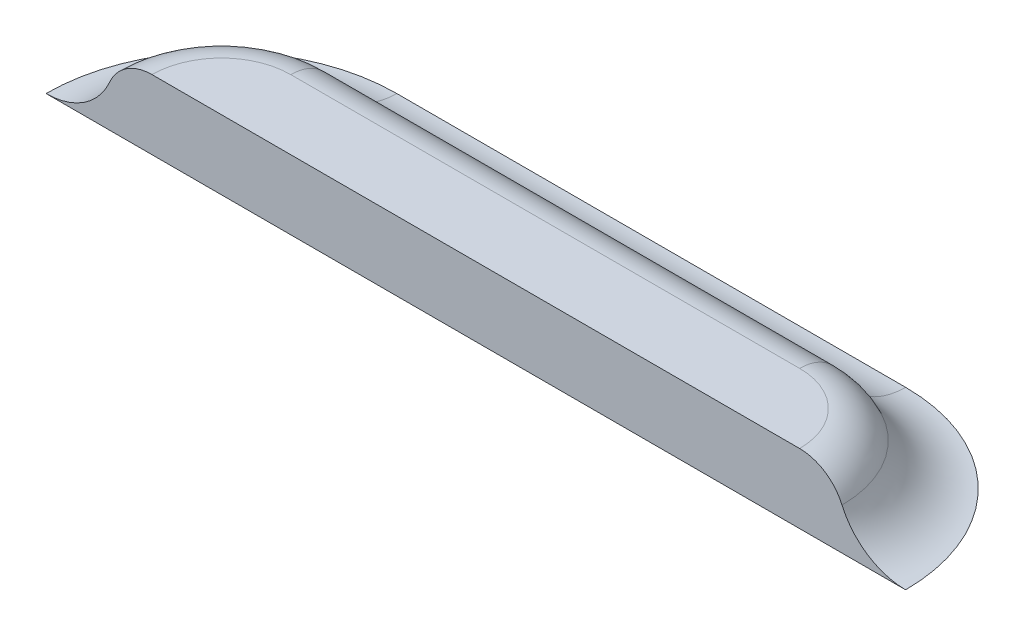
ISO-10303-21;
HEADER;
FILE_DESCRIPTION(('STEP AP214'),'2;1');
FILE_NAME('part.step','',(''),(''),'','','');
FILE_SCHEMA(('AUTOMOTIVE_DESIGN { 1 0 10303 214 1 1 1 1 }'));
ENDSEC;
DATA;
#1=APPLICATION_CONTEXT('core data for automotive mechanical design processes');
#2=APPLICATION_PROTOCOL_DEFINITION('international standard','automotive_design',2000,#1);
#3=PRODUCT_CONTEXT('',#1,'mechanical');
#4=PRODUCT('Part','Part','',(#3));
#5=PRODUCT_RELATED_PRODUCT_CATEGORY('part','',(#4));
#6=PRODUCT_DEFINITION_FORMATION('','',#4);
#7=PRODUCT_DEFINITION_CONTEXT('part definition',#1,'design');
#8=PRODUCT_DEFINITION('design','',#6,#7);
#9=PRODUCT_DEFINITION_SHAPE('','',#8);
#10=(LENGTH_UNIT() NAMED_UNIT(*) SI_UNIT(.MILLI.,.METRE.));
#11=(NAMED_UNIT(*) PLANE_ANGLE_UNIT() SI_UNIT($,.RADIAN.));
#12=(NAMED_UNIT(*) SI_UNIT($,.STERADIAN.) SOLID_ANGLE_UNIT());
#13=UNCERTAINTY_MEASURE_WITH_UNIT(LENGTH_MEASURE(1.E-05),#10,'distance_accuracy_value','');
#14=(GEOMETRIC_REPRESENTATION_CONTEXT(3) GLOBAL_UNCERTAINTY_ASSIGNED_CONTEXT((#13)) GLOBAL_UNIT_ASSIGNED_CONTEXT((#10,
#11,#12)) REPRESENTATION_CONTEXT('',''));
#15=CARTESIAN_POINT('',(0.,0.,0.));
#16=DIRECTION('',(0.,0.,1.));
#17=DIRECTION('',(1.,0.,0.));
#18=AXIS2_PLACEMENT_3D('',#15,#16,#17);
#19=CARTESIAN_POINT('',(50.8,19.05,7.9375));
#20=DIRECTION('',(0.,0.,-1.));
#21=DIRECTION('',(-1.,0.,0.));
#22=AXIS2_PLACEMENT_3D('',#19,#20,#21);
#23=PLANE('',#22);
#24=DIRECTION('',(1.,0.,0.));
#25=VECTOR('',#24,1.);
#26=CARTESIAN_POINT('',(50.8,9.525,7.9375));
#27=LINE('',#26,#25);
#28=CARTESIAN_POINT('',(-58.9996778314848,9.525,7.93750000000001));
#29=VERTEX_POINT('',#28);
#30=CARTESIAN_POINT('',(58.9996778314848,9.525,7.93749999999999));
#31=VERTEX_POINT('',#30);
#32=EDGE_CURVE('E98',#29,#31,#27,.T.);
#33=ORIENTED_EDGE('',*,*,#32,.T.);
#34=CARTESIAN_POINT('',(58.9996778314848,19.05,7.93749999999999));
#35=DIRECTION('',(0.,0.,-1.));
#36=DIRECTION('',(-1.,0.,0.));
#37=AXIS2_PLACEMENT_3D('',#34,#35,#36);
#38=CIRCLE('',#37,9.525);
#39=CARTESIAN_POINT('',(50.2698711325939,15.24,7.93749999999999));
#40=VERTEX_POINT('',#39);
#41=EDGE_CURVE('E12',#31,#40,#38,.T.);
#42=ORIENTED_EDGE('',*,*,#41,.T.);
#43=CARTESIAN_POINT('',(44.45,12.7,7.93749999999999));
#44=DIRECTION('',(0.,0.,-1.));
#45=DIRECTION('',(-1.,0.,0.));
#46=AXIS2_PLACEMENT_3D('',#43,#44,#45);
#47=CIRCLE('',#46,6.35);
#48=CARTESIAN_POINT('',(44.45,19.05,7.9375));
#49=VERTEX_POINT('',#48);
#50=EDGE_CURVE('E114',#40,#49,#47,.F.);
#51=ORIENTED_EDGE('',*,*,#50,.T.);
#52=DIRECTION('',(1.,0.,0.));
#53=VECTOR('',#52,1.);
#54=CARTESIAN_POINT('',(50.8,19.05,7.9375));
#55=LINE('',#54,#53);
#56=CARTESIAN_POINT('',(-44.45,19.05,7.93750000000001));
#57=VERTEX_POINT('',#56);
#58=EDGE_CURVE('E131',#57,#49,#55,.T.);
#59=ORIENTED_EDGE('',*,*,#58,.F.);
#60=CARTESIAN_POINT('',(-44.45,12.7,7.9375));
#61=DIRECTION('',(0.,0.,-1.));
#62=DIRECTION('',(-1.,0.,0.));
#63=AXIS2_PLACEMENT_3D('',#60,#61,#62);
#64=CIRCLE('',#63,6.35);
#65=CARTESIAN_POINT('',(-50.2698711325939,15.24,7.9375));
#66=VERTEX_POINT('',#65);
#67=EDGE_CURVE('E117',#57,#66,#64,.F.);
#68=ORIENTED_EDGE('',*,*,#67,.T.);
#69=CARTESIAN_POINT('',(-58.9996778314848,19.05,7.9375));
#70=DIRECTION('',(0.,0.,-1.));
#71=DIRECTION('',(-1.,0.,0.));
#72=AXIS2_PLACEMENT_3D('',#69,#70,#71);
#73=CIRCLE('',#72,9.525);
#74=EDGE_CURVE('E48',#66,#29,#73,.T.);
#75=ORIENTED_EDGE('',*,*,#74,.T.);
#76=EDGE_LOOP('',(#33,#42,#51,#59,#68,#75));
#77=FACE_BOUND('',#76,.T.);
#78=ADVANCED_FACE('F39',(#77),#23,.F.);
#79=CARTESIAN_POINT('',(0.,19.05,0.));
#80=DIRECTION('',(0.,1.,0.));
#81=DIRECTION('',(0.,0.,1.));
#82=AXIS2_PLACEMENT_3D('',#79,#80,#81);
#83=PLANE('',#82);
#84=ORIENTED_EDGE('',*,*,#58,.T.);
#85=CARTESIAN_POINT('',(34.925,19.05,7.93749999999999));
#86=DIRECTION('',(0.,1.,0.));
#87=DIRECTION('',(0.,0.,1.));
#88=AXIS2_PLACEMENT_3D('',#85,#86,#87);
#89=CIRCLE('',#88,9.525);
#90=CARTESIAN_POINT('',(34.925,19.05,-1.5875));
#91=VERTEX_POINT('',#90);
#92=EDGE_CURVE('E134',#49,#91,#89,.T.);
#93=ORIENTED_EDGE('',*,*,#92,.T.);
#94=DIRECTION('',(-1.,0.,0.));
#95=VECTOR('',#94,1.);
#96=CARTESIAN_POINT('',(-34.925,19.05,-1.5875));
#97=LINE('',#96,#95);
#98=CARTESIAN_POINT('',(-34.925,19.05,-1.5875));
#99=VERTEX_POINT('',#98);
#100=EDGE_CURVE('E147',#91,#99,#97,.T.);
#101=ORIENTED_EDGE('',*,*,#100,.T.);
#102=CARTESIAN_POINT('',(-34.925,19.05,7.9375));
#103=DIRECTION('',(0.,1.,0.));
#104=DIRECTION('',(0.,0.,1.));
#105=AXIS2_PLACEMENT_3D('',#102,#103,#104);
#106=CIRCLE('',#105,9.525);
#107=EDGE_CURVE('E137',#99,#57,#106,.T.);
#108=ORIENTED_EDGE('',*,*,#107,.T.);
#109=EDGE_LOOP('',(#84,#93,#101,#108));
#110=FACE_BOUND('',#109,.T.);
#111=ADVANCED_FACE('F151',(#110),#83,.T.);
#112=CARTESIAN_POINT('',(-34.925,12.7,7.9375));
#113=DIRECTION('',(0.,1.,0.));
#114=DIRECTION('',(0.,0.,1.));
#115=AXIS2_PLACEMENT_3D('',#112,#113,#114);
#116=TOROIDAL_SURFACE('',#115,9.525,6.35);
#117=CARTESIAN_POINT('',(-34.925,12.7,-1.5875));
#118=DIRECTION('',(1.,0.,0.));
#119=DIRECTION('',(0.,0.,-1.));
#120=AXIS2_PLACEMENT_3D('',#117,#118,#119);
#121=CIRCLE('',#120,6.35);
#122=CARTESIAN_POINT('',(-34.925,15.24,-7.40737113259391));
#123=VERTEX_POINT('',#122);
#124=EDGE_CURVE('E120',#123,#99,#121,.T.);
#125=ORIENTED_EDGE('',*,*,#124,.F.);
#126=CARTESIAN_POINT('',(-34.925,15.24,7.9375));
#127=DIRECTION('',(0.,-1.,0.));
#128=DIRECTION('',(0.,0.,-1.));
#129=AXIS2_PLACEMENT_3D('',#126,#127,#128);
#130=CIRCLE('',#129,15.3448711325939);
#131=EDGE_CURVE('E102',#123,#66,#130,.F.);
#132=ORIENTED_EDGE('',*,*,#131,.T.);
#133=ORIENTED_EDGE('',*,*,#67,.F.);
#134=ORIENTED_EDGE('',*,*,#107,.F.);
#135=EDGE_LOOP('',(#125,#132,#133,#134));
#136=FACE_BOUND('',#135,.T.);
#137=ADVANCED_FACE('F152',(#136),#116,.T.);
#138=CARTESIAN_POINT('',(0.,12.7,-1.5875));
#139=DIRECTION('',(1.,0.,0.));
#140=DIRECTION('',(0.,0.,-1.));
#141=AXIS2_PLACEMENT_3D('',#138,#139,#140);
#142=CYLINDRICAL_SURFACE('',#141,6.35);
#143=CARTESIAN_POINT('',(34.925,12.7,-1.5875));
#144=DIRECTION('',(1.,0.,0.));
#145=DIRECTION('',(0.,0.,-1.));
#146=AXIS2_PLACEMENT_3D('',#143,#144,#145);
#147=CIRCLE('',#146,6.35);
#148=CARTESIAN_POINT('',(34.925,15.24,-7.40737113259392));
#149=VERTEX_POINT('',#148);
#150=EDGE_CURVE('E140',#149,#91,#147,.T.);
#151=ORIENTED_EDGE('',*,*,#150,.F.);
#152=DIRECTION('',(1.,0.,0.));
#153=VECTOR('',#152,1.);
#154=CARTESIAN_POINT('',(0.,15.24,-7.40737113259392));
#155=LINE('',#154,#153);
#156=EDGE_CURVE('E125',#149,#123,#155,.F.);
#157=ORIENTED_EDGE('',*,*,#156,.T.);
#158=ORIENTED_EDGE('',*,*,#124,.T.);
#159=ORIENTED_EDGE('',*,*,#100,.F.);
#160=EDGE_LOOP('',(#151,#157,#158,#159));
#161=FACE_BOUND('',#160,.T.);
#162=ADVANCED_FACE('F154',(#161),#142,.T.);
#163=CARTESIAN_POINT('',(34.925,12.7,7.93749999999999));
#164=DIRECTION('',(0.,1.,0.));
#165=DIRECTION('',(0.,0.,1.));
#166=AXIS2_PLACEMENT_3D('',#163,#164,#165);
#167=TOROIDAL_SURFACE('',#166,9.525,6.35);
#168=ORIENTED_EDGE('',*,*,#50,.F.);
#169=CARTESIAN_POINT('',(34.925,15.24,7.93749999999999));
#170=DIRECTION('',(0.,-1.,0.));
#171=DIRECTION('',(0.,0.,-1.));
#172=AXIS2_PLACEMENT_3D('',#169,#170,#171);
#173=CIRCLE('',#172,15.3448711325939);
#174=EDGE_CURVE('E56',#40,#149,#173,.F.);
#175=ORIENTED_EDGE('',*,*,#174,.T.);
#176=ORIENTED_EDGE('',*,*,#150,.T.);
#177=ORIENTED_EDGE('',*,*,#92,.F.);
#178=EDGE_LOOP('',(#168,#175,#176,#177));
#179=FACE_BOUND('',#178,.T.);
#180=ADVANCED_FACE('F160',(#179),#167,.T.);
#181=CARTESIAN_POINT('',(34.925,19.05,7.93749999999999));
#182=DIRECTION('',(0.,1.,0.));
#183=DIRECTION('',(0.,0.,1.));
#184=AXIS2_PLACEMENT_3D('',#181,#182,#183);
#185=TOROIDAL_SURFACE('',#184,24.0746778314848,9.525);
#186=ORIENTED_EDGE('',*,*,#41,.F.);
#187=CARTESIAN_POINT('',(34.925,9.525,7.93749999999999));
#188=DIRECTION('',(0.,1.,0.));
#189=DIRECTION('',(0.,0.,1.));
#190=AXIS2_PLACEMENT_3D('',#187,#188,#189);
#191=CIRCLE('',#190,24.0746778314848);
#192=CARTESIAN_POINT('',(34.925,9.525,-16.1371778314848));
#193=VERTEX_POINT('',#192);
#194=EDGE_CURVE('E103',#193,#31,#191,.F.);
#195=ORIENTED_EDGE('',*,*,#194,.F.);
#196=CARTESIAN_POINT('',(34.925,19.05,-16.1371778314848));
#197=DIRECTION('',(1.,0.,0.));
#198=DIRECTION('',(0.,0.,-1.));
#199=AXIS2_PLACEMENT_3D('',#196,#197,#198);
#200=CIRCLE('',#199,9.525);
#201=EDGE_CURVE('E43',#149,#193,#200,.T.);
#202=ORIENTED_EDGE('',*,*,#201,.F.);
#203=ORIENTED_EDGE('',*,*,#174,.F.);
#204=EDGE_LOOP('',(#186,#195,#202,#203));
#205=FACE_BOUND('',#204,.T.);
#206=ADVANCED_FACE('F41',(#205),#185,.F.);
#207=CARTESIAN_POINT('',(0.,19.05,-16.1371778314848));
#208=DIRECTION('',(1.,0.,0.));
#209=DIRECTION('',(0.,0.,-1.));
#210=AXIS2_PLACEMENT_3D('',#207,#208,#209);
#211=CYLINDRICAL_SURFACE('',#210,9.525);
#212=ORIENTED_EDGE('',*,*,#201,.T.);
#213=DIRECTION('',(-1.,0.,0.));
#214=VECTOR('',#213,1.);
#215=CARTESIAN_POINT('',(34.925,9.525,-16.1371778314848));
#216=LINE('',#215,#214);
#217=CARTESIAN_POINT('',(-34.925,9.525,-16.1371778314848));
#218=VERTEX_POINT('',#217);
#219=EDGE_CURVE('E96',#218,#193,#216,.F.);
#220=ORIENTED_EDGE('',*,*,#219,.F.);
#221=CARTESIAN_POINT('',(-34.925,19.05,-16.1371778314848));
#222=DIRECTION('',(1.,0.,0.));
#223=DIRECTION('',(0.,1.,0.));
#224=AXIS2_PLACEMENT_3D('',#221,#222,#223);
#225=CIRCLE('',#224,9.525);
#226=EDGE_CURVE('E107',#123,#218,#225,.T.);
#227=ORIENTED_EDGE('',*,*,#226,.F.);
#228=ORIENTED_EDGE('',*,*,#156,.F.);
#229=EDGE_LOOP('',(#212,#220,#227,#228));
#230=FACE_BOUND('',#229,.T.);
#231=ADVANCED_FACE('F112',(#230),#211,.F.);
#232=CARTESIAN_POINT('',(-34.925,19.05,7.9375));
#233=DIRECTION('',(0.,1.,0.));
#234=DIRECTION('',(0.,0.,1.));
#235=AXIS2_PLACEMENT_3D('',#232,#233,#234);
#236=TOROIDAL_SURFACE('',#235,24.0746778314848,9.525);
#237=ORIENTED_EDGE('',*,*,#74,.F.);
#238=ORIENTED_EDGE('',*,*,#131,.F.);
#239=ORIENTED_EDGE('',*,*,#226,.T.);
#240=CARTESIAN_POINT('',(-34.925,9.525,7.9375));
#241=DIRECTION('',(0.,1.,0.));
#242=DIRECTION('',(0.,0.,1.));
#243=AXIS2_PLACEMENT_3D('',#240,#241,#242);
#244=CIRCLE('',#243,24.0746778314848);
#245=EDGE_CURVE('E92',#29,#218,#244,.F.);
#246=ORIENTED_EDGE('',*,*,#245,.F.);
#247=EDGE_LOOP('',(#237,#238,#239,#246));
#248=FACE_BOUND('',#247,.T.);
#249=ADVANCED_FACE('F108',(#248),#236,.F.);
#250=CARTESIAN_POINT('',(0.,9.525,0.));
#251=DIRECTION('',(0.,1.,0.));
#252=DIRECTION('',(0.,0.,1.));
#253=AXIS2_PLACEMENT_3D('',#250,#251,#252);
#254=PLANE('',#253);
#255=ORIENTED_EDGE('',*,*,#245,.T.);
#256=ORIENTED_EDGE('',*,*,#219,.T.);
#257=ORIENTED_EDGE('',*,*,#194,.T.);
#258=ORIENTED_EDGE('',*,*,#32,.F.);
#259=EDGE_LOOP('',(#255,#256,#257,#258));
#260=FACE_BOUND('',#259,.T.);
#261=ADVANCED_FACE('F94',(#260),#254,.F.);
#262=CLOSED_SHELL('',(#78,#111,#137,#162,#180,#206,#231,#249,#261));
#263=MANIFOLD_SOLID_BREP('B2',#262);
#264=ADVANCED_BREP_SHAPE_REPRESENTATION('',(#18,#263),#14);
#265=SHAPE_DEFINITION_REPRESENTATION(#9,#264);
ENDSEC;
END-ISO-10303-21;
